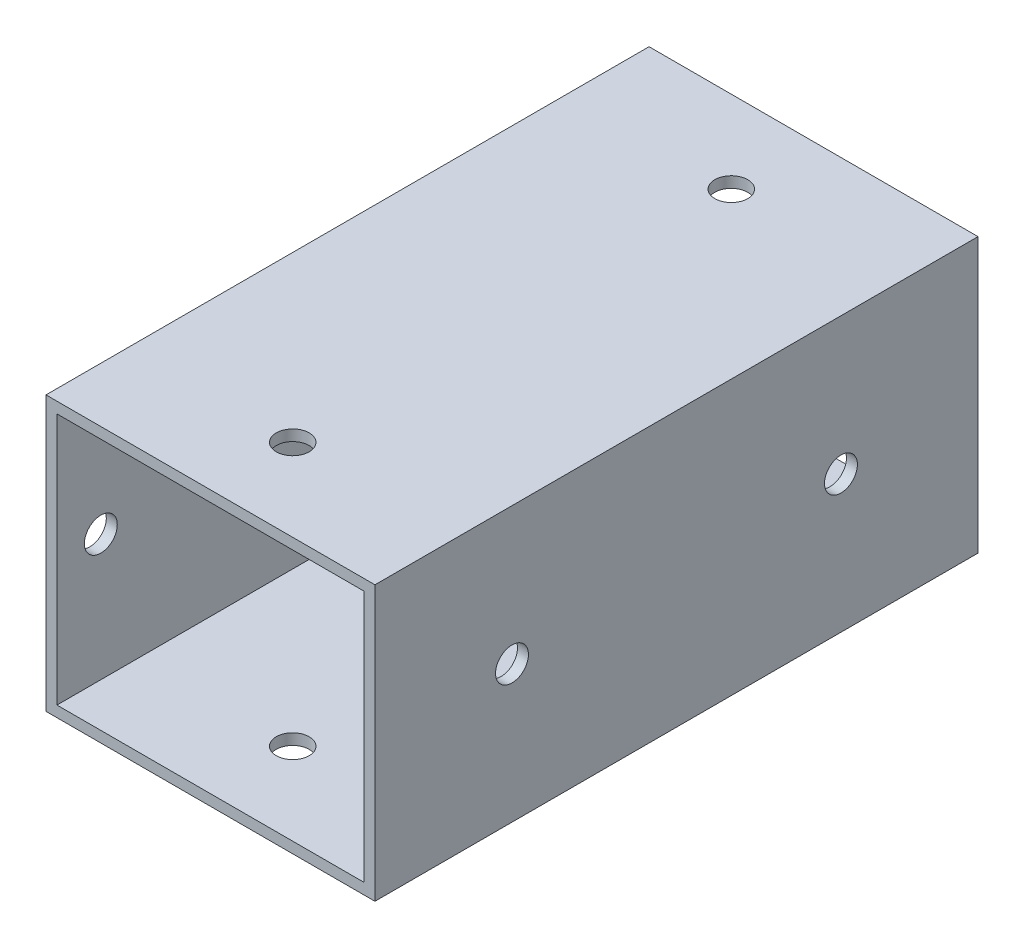
ISO-10303-21;
HEADER;
FILE_DESCRIPTION(('STEP AP214'),'2;1');
FILE_NAME('part.step','',(''),(''),'','','');
FILE_SCHEMA(('AUTOMOTIVE_DESIGN { 1 0 10303 214 1 1 1 1 }'));
ENDSEC;
DATA;
#1=APPLICATION_CONTEXT('core data for automotive mechanical design processes');
#2=APPLICATION_PROTOCOL_DEFINITION('international standard','automotive_design',2000,#1);
#3=PRODUCT_CONTEXT('',#1,'mechanical');
#4=PRODUCT('Part','Part','',(#3));
#5=PRODUCT_RELATED_PRODUCT_CATEGORY('part','',(#4));
#6=PRODUCT_DEFINITION_FORMATION('','',#4);
#7=PRODUCT_DEFINITION_CONTEXT('part definition',#1,'design');
#8=PRODUCT_DEFINITION('design','',#6,#7);
#9=PRODUCT_DEFINITION_SHAPE('','',#8);
#10=(LENGTH_UNIT() NAMED_UNIT(*) SI_UNIT(.MILLI.,.METRE.));
#11=(NAMED_UNIT(*) PLANE_ANGLE_UNIT() SI_UNIT($,.RADIAN.));
#12=(NAMED_UNIT(*) SI_UNIT($,.STERADIAN.) SOLID_ANGLE_UNIT());
#13=UNCERTAINTY_MEASURE_WITH_UNIT(LENGTH_MEASURE(1.E-05),#10,'distance_accuracy_value','');
#14=(GEOMETRIC_REPRESENTATION_CONTEXT(3) GLOBAL_UNCERTAINTY_ASSIGNED_CONTEXT((#13)) GLOBAL_UNIT_ASSIGNED_CONTEXT((#10,
#11,#12)) REPRESENTATION_CONTEXT('',''));
#15=CARTESIAN_POINT('',(0.,0.,0.));
#16=DIRECTION('',(0.,0.,1.));
#17=DIRECTION('',(1.,0.,0.));
#18=AXIS2_PLACEMENT_3D('',#15,#16,#17);
#19=CARTESIAN_POINT('',(0.,0.,27.5));
#20=DIRECTION('',(0.,0.,-1.));
#21=DIRECTION('',(-1.,0.,0.));
#22=AXIS2_PLACEMENT_3D('',#19,#20,#21);
#23=PLANE('',#22);
#24=DIRECTION('',(0.,1.,0.));
#25=VECTOR('',#24,1.);
#26=CARTESIAN_POINT('',(15.,-12.5,27.5));
#27=LINE('',#26,#25);
#28=CARTESIAN_POINT('',(15.,-12.5,27.5));
#29=VERTEX_POINT('',#28);
#30=CARTESIAN_POINT('',(15.,12.5,27.5));
#31=VERTEX_POINT('',#30);
#32=EDGE_CURVE('E139',#29,#31,#27,.T.);
#33=ORIENTED_EDGE('',*,*,#32,.T.);
#34=DIRECTION('',(-1.,0.,0.));
#35=VECTOR('',#34,1.);
#36=CARTESIAN_POINT('',(-15.,12.5,27.5));
#37=LINE('',#36,#35);
#38=CARTESIAN_POINT('',(-15.,12.5,27.5));
#39=VERTEX_POINT('',#38);
#40=EDGE_CURVE('E142',#31,#39,#37,.T.);
#41=ORIENTED_EDGE('',*,*,#40,.T.);
#42=DIRECTION('',(0.,-1.,0.));
#43=VECTOR('',#42,1.);
#44=CARTESIAN_POINT('',(-15.,-12.5,27.5));
#45=LINE('',#44,#43);
#46=CARTESIAN_POINT('',(-15.,-12.5,27.5));
#47=VERTEX_POINT('',#46);
#48=EDGE_CURVE('E145',#39,#47,#45,.T.);
#49=ORIENTED_EDGE('',*,*,#48,.T.);
#50=DIRECTION('',(1.,0.,0.));
#51=VECTOR('',#50,1.);
#52=CARTESIAN_POINT('',(-15.,-12.5,27.5));
#53=LINE('',#52,#51);
#54=EDGE_CURVE('E147',#47,#29,#53,.T.);
#55=ORIENTED_EDGE('',*,*,#54,.T.);
#56=EDGE_LOOP('',(#33,#41,#49,#55));
#57=FACE_BOUND('',#56,.T.);
#58=DIRECTION('',(1.,0.,0.));
#59=VECTOR('',#58,1.);
#60=CARTESIAN_POINT('',(-14.,-11.5,27.5));
#61=LINE('',#60,#59);
#62=CARTESIAN_POINT('',(-14.,-11.5,27.5));
#63=VERTEX_POINT('',#62);
#64=CARTESIAN_POINT('',(14.,-11.5,27.5));
#65=VERTEX_POINT('',#64);
#66=EDGE_CURVE('E101',#63,#65,#61,.T.);
#67=ORIENTED_EDGE('',*,*,#66,.F.);
#68=DIRECTION('',(0.,-1.,0.));
#69=VECTOR('',#68,1.);
#70=CARTESIAN_POINT('',(-14.,-11.5,27.5));
#71=LINE('',#70,#69);
#72=CARTESIAN_POINT('',(-14.,11.5,27.5));
#73=VERTEX_POINT('',#72);
#74=EDGE_CURVE('E123',#73,#63,#71,.T.);
#75=ORIENTED_EDGE('',*,*,#74,.F.);
#76=DIRECTION('',(-1.,0.,0.));
#77=VECTOR('',#76,1.);
#78=CARTESIAN_POINT('',(-14.,11.5,27.5));
#79=LINE('',#78,#77);
#80=CARTESIAN_POINT('',(14.,11.5,27.5));
#81=VERTEX_POINT('',#80);
#82=EDGE_CURVE('E121',#81,#73,#79,.T.);
#83=ORIENTED_EDGE('',*,*,#82,.F.);
#84=DIRECTION('',(0.,1.,0.));
#85=VECTOR('',#84,1.);
#86=CARTESIAN_POINT('',(14.,-11.5,27.5));
#87=LINE('',#86,#85);
#88=EDGE_CURVE('E109',#65,#81,#87,.T.);
#89=ORIENTED_EDGE('',*,*,#88,.F.);
#90=EDGE_LOOP('',(#67,#75,#83,#89));
#91=FACE_BOUND('',#90,.T.);
#92=ADVANCED_FACE('F34',(#57,#91),#23,.F.);
#93=CARTESIAN_POINT('',(0.,0.,-27.5));
#94=DIRECTION('',(0.,0.,-1.));
#95=DIRECTION('',(-1.,0.,0.));
#96=AXIS2_PLACEMENT_3D('',#93,#94,#95);
#97=PLANE('',#96);
#98=DIRECTION('',(0.,1.,0.));
#99=VECTOR('',#98,1.);
#100=CARTESIAN_POINT('',(15.,-12.5,-27.5));
#101=LINE('',#100,#99);
#102=CARTESIAN_POINT('',(15.,-12.5,-27.5));
#103=VERTEX_POINT('',#102);
#104=CARTESIAN_POINT('',(15.,12.5,-27.5));
#105=VERTEX_POINT('',#104);
#106=EDGE_CURVE('E117',#103,#105,#101,.T.);
#107=ORIENTED_EDGE('',*,*,#106,.F.);
#108=DIRECTION('',(1.,0.,0.));
#109=VECTOR('',#108,1.);
#110=CARTESIAN_POINT('',(-15.,-12.5,-27.5));
#111=LINE('',#110,#109);
#112=CARTESIAN_POINT('',(-15.,-12.5,-27.5));
#113=VERTEX_POINT('',#112);
#114=EDGE_CURVE('E143',#113,#103,#111,.T.);
#115=ORIENTED_EDGE('',*,*,#114,.F.);
#116=DIRECTION('',(0.,-1.,0.));
#117=VECTOR('',#116,1.);
#118=CARTESIAN_POINT('',(-15.,-12.5,-27.5));
#119=LINE('',#118,#117);
#120=CARTESIAN_POINT('',(-15.,12.5,-27.5));
#121=VERTEX_POINT('',#120);
#122=EDGE_CURVE('E154',#121,#113,#119,.T.);
#123=ORIENTED_EDGE('',*,*,#122,.F.);
#124=DIRECTION('',(-1.,0.,0.));
#125=VECTOR('',#124,1.);
#126=CARTESIAN_POINT('',(-15.,12.5,-27.5));
#127=LINE('',#126,#125);
#128=EDGE_CURVE('E152',#105,#121,#127,.T.);
#129=ORIENTED_EDGE('',*,*,#128,.F.);
#130=EDGE_LOOP('',(#107,#115,#123,#129));
#131=FACE_BOUND('',#130,.T.);
#132=DIRECTION('',(0.,-1.,0.));
#133=VECTOR('',#132,1.);
#134=CARTESIAN_POINT('',(-14.,-11.5,-27.5));
#135=LINE('',#134,#133);
#136=CARTESIAN_POINT('',(-14.,11.5,-27.5));
#137=VERTEX_POINT('',#136);
#138=CARTESIAN_POINT('',(-14.,-11.5,-27.5));
#139=VERTEX_POINT('',#138);
#140=EDGE_CURVE('E110',#137,#139,#135,.T.);
#141=ORIENTED_EDGE('',*,*,#140,.T.);
#142=DIRECTION('',(1.,0.,0.));
#143=VECTOR('',#142,1.);
#144=CARTESIAN_POINT('',(-14.,-11.5,-27.5));
#145=LINE('',#144,#143);
#146=CARTESIAN_POINT('',(14.,-11.5,-27.5));
#147=VERTEX_POINT('',#146);
#148=EDGE_CURVE('E59',#139,#147,#145,.T.);
#149=ORIENTED_EDGE('',*,*,#148,.T.);
#150=DIRECTION('',(0.,1.,0.));
#151=VECTOR('',#150,1.);
#152=CARTESIAN_POINT('',(14.,-11.5,-27.5));
#153=LINE('',#152,#151);
#154=CARTESIAN_POINT('',(14.,11.5,-27.5));
#155=VERTEX_POINT('',#154);
#156=EDGE_CURVE('E116',#147,#155,#153,.T.);
#157=ORIENTED_EDGE('',*,*,#156,.T.);
#158=DIRECTION('',(-1.,0.,0.));
#159=VECTOR('',#158,1.);
#160=CARTESIAN_POINT('',(-14.,11.5,-27.5));
#161=LINE('',#160,#159);
#162=EDGE_CURVE('E131',#155,#137,#161,.T.);
#163=ORIENTED_EDGE('',*,*,#162,.T.);
#164=EDGE_LOOP('',(#141,#149,#157,#163));
#165=FACE_BOUND('',#164,.T.);
#166=ADVANCED_FACE('F241',(#131,#165),#97,.T.);
#167=CARTESIAN_POINT('',(15.,-12.5,27.5));
#168=DIRECTION('',(-1.,0.,0.));
#169=DIRECTION('',(0.,0.,1.));
#170=AXIS2_PLACEMENT_3D('',#167,#168,#169);
#171=PLANE('',#170);
#172=CARTESIAN_POINT('',(15.,0.,-15.));
#173=DIRECTION('',(1.,0.,0.));
#174=DIRECTION('',(0.,0.,-1.));
#175=AXIS2_PLACEMENT_3D('',#172,#173,#174);
#176=CIRCLE('',#175,1.5);
#177=CARTESIAN_POINT('',(15.,0.,-16.5));
#178=VERTEX_POINT('',#177);
#179=EDGE_CURVE('E175',#178,#178,#176,.T.);
#180=ORIENTED_EDGE('',*,*,#179,.F.);
#181=EDGE_LOOP('',(#180));
#182=FACE_BOUND('',#181,.T.);
#183=CARTESIAN_POINT('',(15.,0.,15.));
#184=DIRECTION('',(1.,0.,0.));
#185=DIRECTION('',(0.,0.,-1.));
#186=AXIS2_PLACEMENT_3D('',#183,#184,#185);
#187=CIRCLE('',#186,1.5);
#188=CARTESIAN_POINT('',(15.,0.,13.5));
#189=VERTEX_POINT('',#188);
#190=EDGE_CURVE('E181',#189,#189,#187,.T.);
#191=ORIENTED_EDGE('',*,*,#190,.F.);
#192=EDGE_LOOP('',(#191));
#193=FACE_BOUND('',#192,.T.);
#194=ORIENTED_EDGE('',*,*,#106,.T.);
#195=DIRECTION('',(0.,0.,-1.));
#196=VECTOR('',#195,1.);
#197=CARTESIAN_POINT('',(15.,12.5,27.5));
#198=LINE('',#197,#196);
#199=EDGE_CURVE('E11',#31,#105,#198,.T.);
#200=ORIENTED_EDGE('',*,*,#199,.F.);
#201=ORIENTED_EDGE('',*,*,#32,.F.);
#202=DIRECTION('',(0.,0.,-1.));
#203=VECTOR('',#202,1.);
#204=CARTESIAN_POINT('',(15.,-12.5,27.5));
#205=LINE('',#204,#203);
#206=EDGE_CURVE('E149',#29,#103,#205,.T.);
#207=ORIENTED_EDGE('',*,*,#206,.T.);
#208=EDGE_LOOP('',(#194,#200,#201,#207));
#209=FACE_BOUND('',#208,.T.);
#210=ADVANCED_FACE('F36',(#182,#193,#209),#171,.F.);
#211=CARTESIAN_POINT('',(-15.,12.5,27.5));
#212=DIRECTION('',(0.,-1.,0.));
#213=DIRECTION('',(0.,0.,-1.));
#214=AXIS2_PLACEMENT_3D('',#211,#212,#213);
#215=PLANE('',#214);
#216=CARTESIAN_POINT('',(0.,12.5,-20.));
#217=DIRECTION('',(0.,1.,0.));
#218=DIRECTION('',(0.,0.,1.));
#219=AXIS2_PLACEMENT_3D('',#216,#217,#218);
#220=CIRCLE('',#219,1.5);
#221=CARTESIAN_POINT('',(0.,12.5,-18.5));
#222=VERTEX_POINT('',#221);
#223=EDGE_CURVE('E168',#222,#222,#220,.T.);
#224=ORIENTED_EDGE('',*,*,#223,.F.);
#225=EDGE_LOOP('',(#224));
#226=FACE_BOUND('',#225,.T.);
#227=CARTESIAN_POINT('',(0.,12.5,20.));
#228=DIRECTION('',(0.,1.,0.));
#229=DIRECTION('',(0.,0.,1.));
#230=AXIS2_PLACEMENT_3D('',#227,#228,#229);
#231=CIRCLE('',#230,1.5);
#232=CARTESIAN_POINT('',(0.,12.5,21.5));
#233=VERTEX_POINT('',#232);
#234=EDGE_CURVE('E205',#233,#233,#231,.T.);
#235=ORIENTED_EDGE('',*,*,#234,.F.);
#236=EDGE_LOOP('',(#235));
#237=FACE_BOUND('',#236,.T.);
#238=ORIENTED_EDGE('',*,*,#128,.T.);
#239=DIRECTION('',(0.,0.,-1.));
#240=VECTOR('',#239,1.);
#241=CARTESIAN_POINT('',(-15.,12.5,27.5));
#242=LINE('',#241,#240);
#243=EDGE_CURVE('E43',#39,#121,#242,.T.);
#244=ORIENTED_EDGE('',*,*,#243,.F.);
#245=ORIENTED_EDGE('',*,*,#40,.F.);
#246=ORIENTED_EDGE('',*,*,#199,.T.);
#247=EDGE_LOOP('',(#238,#244,#245,#246));
#248=FACE_BOUND('',#247,.T.);
#249=ADVANCED_FACE('F256',(#226,#237,#248),#215,.F.);
#250=CARTESIAN_POINT('',(-15.,-12.5,27.5));
#251=DIRECTION('',(1.,0.,0.));
#252=DIRECTION('',(0.,0.,-1.));
#253=AXIS2_PLACEMENT_3D('',#250,#251,#252);
#254=PLANE('',#253);
#255=CARTESIAN_POINT('',(-15.,0.,-23.5));
#256=DIRECTION('',(1.,0.,0.));
#257=DIRECTION('',(0.,0.,-1.));
#258=AXIS2_PLACEMENT_3D('',#255,#256,#257);
#259=CIRCLE('',#258,1.5);
#260=CARTESIAN_POINT('',(-15.,0.,-25.));
#261=VERTEX_POINT('',#260);
#262=EDGE_CURVE('E202',#261,#261,#259,.T.);
#263=ORIENTED_EDGE('',*,*,#262,.T.);
#264=EDGE_LOOP('',(#263));
#265=FACE_BOUND('',#264,.T.);
#266=CARTESIAN_POINT('',(-15.,0.,23.5));
#267=DIRECTION('',(1.,0.,0.));
#268=DIRECTION('',(0.,0.,-1.));
#269=AXIS2_PLACEMENT_3D('',#266,#267,#268);
#270=CIRCLE('',#269,1.5);
#271=CARTESIAN_POINT('',(-15.,0.,22.));
#272=VERTEX_POINT('',#271);
#273=EDGE_CURVE('E199',#272,#272,#270,.T.);
#274=ORIENTED_EDGE('',*,*,#273,.T.);
#275=EDGE_LOOP('',(#274));
#276=FACE_BOUND('',#275,.T.);
#277=CARTESIAN_POINT('',(-15.,0.,0.));
#278=DIRECTION('',(1.,0.,0.));
#279=DIRECTION('',(0.,0.,-1.));
#280=AXIS2_PLACEMENT_3D('',#277,#278,#279);
#281=CIRCLE('',#280,1.5);
#282=CARTESIAN_POINT('',(-15.,0.,-1.5));
#283=VERTEX_POINT('',#282);
#284=EDGE_CURVE('E196',#283,#283,#281,.T.);
#285=ORIENTED_EDGE('',*,*,#284,.T.);
#286=EDGE_LOOP('',(#285));
#287=FACE_BOUND('',#286,.T.);
#288=ORIENTED_EDGE('',*,*,#122,.T.);
#289=DIRECTION('',(0.,0.,-1.));
#290=VECTOR('',#289,1.);
#291=CARTESIAN_POINT('',(-15.,-12.5,27.5));
#292=LINE('',#291,#290);
#293=EDGE_CURVE('E159',#47,#113,#292,.T.);
#294=ORIENTED_EDGE('',*,*,#293,.F.);
#295=ORIENTED_EDGE('',*,*,#48,.F.);
#296=ORIENTED_EDGE('',*,*,#243,.T.);
#297=EDGE_LOOP('',(#288,#294,#295,#296));
#298=FACE_BOUND('',#297,.T.);
#299=ADVANCED_FACE('F254',(#265,#276,#287,#298),#254,.F.);
#300=CARTESIAN_POINT('',(-15.,-12.5,27.5));
#301=DIRECTION('',(0.,1.,0.));
#302=DIRECTION('',(0.,0.,1.));
#303=AXIS2_PLACEMENT_3D('',#300,#301,#302);
#304=PLANE('',#303);
#305=CARTESIAN_POINT('',(0.,-12.5,-20.));
#306=DIRECTION('',(0.,1.,0.));
#307=DIRECTION('',(0.,0.,1.));
#308=AXIS2_PLACEMENT_3D('',#305,#306,#307);
#309=CIRCLE('',#308,1.5);
#310=CARTESIAN_POINT('',(0.,-12.5,-18.5));
#311=VERTEX_POINT('',#310);
#312=EDGE_CURVE('E129',#311,#311,#309,.T.);
#313=ORIENTED_EDGE('',*,*,#312,.T.);
#314=EDGE_LOOP('',(#313));
#315=FACE_BOUND('',#314,.T.);
#316=CARTESIAN_POINT('',(0.,-12.5,20.));
#317=DIRECTION('',(0.,1.,0.));
#318=DIRECTION('',(0.,0.,1.));
#319=AXIS2_PLACEMENT_3D('',#316,#317,#318);
#320=CIRCLE('',#319,1.5);
#321=CARTESIAN_POINT('',(0.,-12.5,21.5));
#322=VERTEX_POINT('',#321);
#323=EDGE_CURVE('E172',#322,#322,#320,.T.);
#324=ORIENTED_EDGE('',*,*,#323,.T.);
#325=EDGE_LOOP('',(#324));
#326=FACE_BOUND('',#325,.T.);
#327=ORIENTED_EDGE('',*,*,#114,.T.);
#328=ORIENTED_EDGE('',*,*,#206,.F.);
#329=ORIENTED_EDGE('',*,*,#54,.F.);
#330=ORIENTED_EDGE('',*,*,#293,.T.);
#331=EDGE_LOOP('',(#327,#328,#329,#330));
#332=FACE_BOUND('',#331,.T.);
#333=ADVANCED_FACE('F218',(#315,#326,#332),#304,.F.);
#334=CARTESIAN_POINT('',(-14.,-11.5,27.5));
#335=DIRECTION('',(0.,1.,0.));
#336=DIRECTION('',(0.,0.,1.));
#337=AXIS2_PLACEMENT_3D('',#334,#335,#336);
#338=PLANE('',#337);
#339=CARTESIAN_POINT('',(0.,-11.5,-20.));
#340=DIRECTION('',(0.,1.,0.));
#341=DIRECTION('',(0.,0.,1.));
#342=AXIS2_PLACEMENT_3D('',#339,#340,#341);
#343=CIRCLE('',#342,1.5);
#344=CARTESIAN_POINT('',(0.,-11.5,-18.5));
#345=VERTEX_POINT('',#344);
#346=EDGE_CURVE('E171',#345,#345,#343,.T.);
#347=ORIENTED_EDGE('',*,*,#346,.F.);
#348=EDGE_LOOP('',(#347));
#349=FACE_BOUND('',#348,.T.);
#350=CARTESIAN_POINT('',(0.,-11.5,20.));
#351=DIRECTION('',(0.,1.,0.));
#352=DIRECTION('',(0.,0.,1.));
#353=AXIS2_PLACEMENT_3D('',#350,#351,#352);
#354=CIRCLE('',#353,1.5);
#355=CARTESIAN_POINT('',(0.,-11.5,21.5));
#356=VERTEX_POINT('',#355);
#357=EDGE_CURVE('E167',#356,#356,#354,.T.);
#358=ORIENTED_EDGE('',*,*,#357,.F.);
#359=EDGE_LOOP('',(#358));
#360=FACE_BOUND('',#359,.T.);
#361=ORIENTED_EDGE('',*,*,#148,.F.);
#362=DIRECTION('',(0.,0.,-1.));
#363=VECTOR('',#362,1.);
#364=CARTESIAN_POINT('',(-14.,-11.5,27.5));
#365=LINE('',#364,#363);
#366=EDGE_CURVE('E105',#63,#139,#365,.T.);
#367=ORIENTED_EDGE('',*,*,#366,.F.);
#368=ORIENTED_EDGE('',*,*,#66,.T.);
#369=DIRECTION('',(0.,0.,-1.));
#370=VECTOR('',#369,1.);
#371=CARTESIAN_POINT('',(14.,-11.5,27.5));
#372=LINE('',#371,#370);
#373=EDGE_CURVE('E104',#65,#147,#372,.T.);
#374=ORIENTED_EDGE('',*,*,#373,.T.);
#375=EDGE_LOOP('',(#361,#367,#368,#374));
#376=FACE_BOUND('',#375,.T.);
#377=ADVANCED_FACE('F103',(#349,#360,#376),#338,.T.);
#378=CARTESIAN_POINT('',(14.,-11.5,27.5));
#379=DIRECTION('',(-1.,0.,0.));
#380=DIRECTION('',(0.,-1.,0.));
#381=AXIS2_PLACEMENT_3D('',#378,#379,#380);
#382=PLANE('',#381);
#383=CARTESIAN_POINT('',(14.,0.,-15.));
#384=DIRECTION('',(-1.,0.,0.));
#385=DIRECTION('',(0.,-1.,0.));
#386=AXIS2_PLACEMENT_3D('',#383,#384,#385);
#387=CIRCLE('',#386,1.5);
#388=CARTESIAN_POINT('',(14.,-1.5,-15.));
#389=VERTEX_POINT('',#388);
#390=EDGE_CURVE('E38',#389,#389,#387,.T.);
#391=ORIENTED_EDGE('',*,*,#390,.F.);
#392=EDGE_LOOP('',(#391));
#393=FACE_BOUND('',#392,.T.);
#394=CARTESIAN_POINT('',(14.,0.,15.));
#395=DIRECTION('',(-1.,0.,0.));
#396=DIRECTION('',(0.,-1.,0.));
#397=AXIS2_PLACEMENT_3D('',#394,#395,#396);
#398=CIRCLE('',#397,1.5);
#399=CARTESIAN_POINT('',(14.,-1.5,15.));
#400=VERTEX_POINT('',#399);
#401=EDGE_CURVE('E173',#400,#400,#398,.T.);
#402=ORIENTED_EDGE('',*,*,#401,.F.);
#403=EDGE_LOOP('',(#402));
#404=FACE_BOUND('',#403,.T.);
#405=ORIENTED_EDGE('',*,*,#156,.F.);
#406=ORIENTED_EDGE('',*,*,#373,.F.);
#407=ORIENTED_EDGE('',*,*,#88,.T.);
#408=DIRECTION('',(0.,0.,-1.));
#409=VECTOR('',#408,1.);
#410=CARTESIAN_POINT('',(14.,11.5,27.5));
#411=LINE('',#410,#409);
#412=EDGE_CURVE('E118',#81,#155,#411,.T.);
#413=ORIENTED_EDGE('',*,*,#412,.T.);
#414=EDGE_LOOP('',(#405,#406,#407,#413));
#415=FACE_BOUND('',#414,.T.);
#416=ADVANCED_FACE('F113',(#393,#404,#415),#382,.T.);
#417=CARTESIAN_POINT('',(-14.,11.5,27.5));
#418=DIRECTION('',(0.,-1.,0.));
#419=DIRECTION('',(0.,0.,-1.));
#420=AXIS2_PLACEMENT_3D('',#417,#418,#419);
#421=PLANE('',#420);
#422=CARTESIAN_POINT('',(0.,11.5,-20.));
#423=DIRECTION('',(0.,-1.,0.));
#424=DIRECTION('',(0.,0.,-1.));
#425=AXIS2_PLACEMENT_3D('',#422,#423,#424);
#426=CIRCLE('',#425,1.5);
#427=CARTESIAN_POINT('',(0.,11.5,-21.5));
#428=VERTEX_POINT('',#427);
#429=EDGE_CURVE('E169',#428,#428,#426,.T.);
#430=ORIENTED_EDGE('',*,*,#429,.F.);
#431=EDGE_LOOP('',(#430));
#432=FACE_BOUND('',#431,.T.);
#433=CARTESIAN_POINT('',(0.,11.5,20.));
#434=DIRECTION('',(0.,-1.,0.));
#435=DIRECTION('',(0.,0.,-1.));
#436=AXIS2_PLACEMENT_3D('',#433,#434,#435);
#437=CIRCLE('',#436,1.5);
#438=CARTESIAN_POINT('',(0.,11.5,18.5));
#439=VERTEX_POINT('',#438);
#440=EDGE_CURVE('E164',#439,#439,#437,.T.);
#441=ORIENTED_EDGE('',*,*,#440,.F.);
#442=EDGE_LOOP('',(#441));
#443=FACE_BOUND('',#442,.T.);
#444=ORIENTED_EDGE('',*,*,#162,.F.);
#445=ORIENTED_EDGE('',*,*,#412,.F.);
#446=ORIENTED_EDGE('',*,*,#82,.T.);
#447=DIRECTION('',(0.,0.,-1.));
#448=VECTOR('',#447,1.);
#449=CARTESIAN_POINT('',(-14.,11.5,27.5));
#450=LINE('',#449,#448);
#451=EDGE_CURVE('E51',#73,#137,#450,.T.);
#452=ORIENTED_EDGE('',*,*,#451,.T.);
#453=EDGE_LOOP('',(#444,#445,#446,#452));
#454=FACE_BOUND('',#453,.T.);
#455=ADVANCED_FACE('F285',(#432,#443,#454),#421,.T.);
#456=CARTESIAN_POINT('',(-14.,-11.5,27.5));
#457=DIRECTION('',(1.,0.,0.));
#458=DIRECTION('',(0.,0.,-1.));
#459=AXIS2_PLACEMENT_3D('',#456,#457,#458);
#460=PLANE('',#459);
#461=CARTESIAN_POINT('',(-14.,0.,-23.5));
#462=DIRECTION('',(1.,0.,0.));
#463=DIRECTION('',(0.,0.,1.));
#464=AXIS2_PLACEMENT_3D('',#461,#462,#463);
#465=CIRCLE('',#464,1.5);
#466=CARTESIAN_POINT('',(-14.,0.,-22.));
#467=VERTEX_POINT('',#466);
#468=EDGE_CURVE('E179',#467,#467,#465,.T.);
#469=ORIENTED_EDGE('',*,*,#468,.F.);
#470=EDGE_LOOP('',(#469));
#471=FACE_BOUND('',#470,.T.);
#472=CARTESIAN_POINT('',(-14.,0.,23.5));
#473=DIRECTION('',(1.,0.,0.));
#474=DIRECTION('',(0.,0.,-1.));
#475=AXIS2_PLACEMENT_3D('',#472,#473,#474);
#476=CIRCLE('',#475,1.5);
#477=CARTESIAN_POINT('',(-14.,0.,22.));
#478=VERTEX_POINT('',#477);
#479=EDGE_CURVE('E188',#478,#478,#476,.T.);
#480=ORIENTED_EDGE('',*,*,#479,.F.);
#481=EDGE_LOOP('',(#480));
#482=FACE_BOUND('',#481,.T.);
#483=CARTESIAN_POINT('',(-14.,0.,0.));
#484=DIRECTION('',(1.,0.,0.));
#485=DIRECTION('',(0.,0.,-1.));
#486=AXIS2_PLACEMENT_3D('',#483,#484,#485);
#487=CIRCLE('',#486,1.5);
#488=CARTESIAN_POINT('',(-14.,0.,-1.5));
#489=VERTEX_POINT('',#488);
#490=EDGE_CURVE('E191',#489,#489,#487,.T.);
#491=ORIENTED_EDGE('',*,*,#490,.F.);
#492=EDGE_LOOP('',(#491));
#493=FACE_BOUND('',#492,.T.);
#494=ORIENTED_EDGE('',*,*,#140,.F.);
#495=ORIENTED_EDGE('',*,*,#451,.F.);
#496=ORIENTED_EDGE('',*,*,#74,.T.);
#497=ORIENTED_EDGE('',*,*,#366,.T.);
#498=EDGE_LOOP('',(#494,#495,#496,#497));
#499=FACE_BOUND('',#498,.T.);
#500=ADVANCED_FACE('F283',(#471,#482,#493,#499),#460,.T.);
#501=CARTESIAN_POINT('',(0.,-57.5,20.));
#502=DIRECTION('',(0.,1.,0.));
#503=DIRECTION('',(0.,0.,1.));
#504=AXIS2_PLACEMENT_3D('',#501,#502,#503);
#505=CYLINDRICAL_SURFACE('',#504,1.5);
#506=ORIENTED_EDGE('',*,*,#440,.T.);
#507=EDGE_LOOP('',(#506));
#508=FACE_BOUND('',#507,.T.);
#509=ORIENTED_EDGE('',*,*,#234,.T.);
#510=EDGE_LOOP('',(#509));
#511=FACE_BOUND('',#510,.T.);
#512=ADVANCED_FACE('F237',(#508,#511),#505,.F.);
#513=CARTESIAN_POINT('',(0.,-57.5,-20.));
#514=DIRECTION('',(0.,1.,0.));
#515=DIRECTION('',(0.,0.,1.));
#516=AXIS2_PLACEMENT_3D('',#513,#514,#515);
#517=CYLINDRICAL_SURFACE('',#516,1.5);
#518=ORIENTED_EDGE('',*,*,#429,.T.);
#519=EDGE_LOOP('',(#518));
#520=FACE_BOUND('',#519,.T.);
#521=ORIENTED_EDGE('',*,*,#223,.T.);
#522=EDGE_LOOP('',(#521));
#523=FACE_BOUND('',#522,.T.);
#524=ADVANCED_FACE('F227',(#520,#523),#517,.F.);
#525=ORIENTED_EDGE('',*,*,#357,.T.);
#526=EDGE_LOOP('',(#525));
#527=FACE_BOUND('',#526,.T.);
#528=ORIENTED_EDGE('',*,*,#323,.F.);
#529=EDGE_LOOP('',(#528));
#530=FACE_BOUND('',#529,.T.);
#531=ADVANCED_FACE('F224',(#527,#530),#505,.F.);
#532=ORIENTED_EDGE('',*,*,#346,.T.);
#533=EDGE_LOOP('',(#532));
#534=FACE_BOUND('',#533,.T.);
#535=ORIENTED_EDGE('',*,*,#312,.F.);
#536=EDGE_LOOP('',(#535));
#537=FACE_BOUND('',#536,.T.);
#538=ADVANCED_FACE('F221',(#534,#537),#517,.F.);
#539=CARTESIAN_POINT('',(-34.,0.,0.));
#540=DIRECTION('',(1.,0.,0.));
#541=DIRECTION('',(0.,0.,-1.));
#542=AXIS2_PLACEMENT_3D('',#539,#540,#541);
#543=CYLINDRICAL_SURFACE('',#542,1.5);
#544=ORIENTED_EDGE('',*,*,#490,.T.);
#545=EDGE_LOOP('',(#544));
#546=FACE_BOUND('',#545,.T.);
#547=ORIENTED_EDGE('',*,*,#284,.F.);
#548=EDGE_LOOP('',(#547));
#549=FACE_BOUND('',#548,.T.);
#550=ADVANCED_FACE('F223',(#546,#549),#543,.F.);
#551=CARTESIAN_POINT('',(-34.,0.,23.5));
#552=DIRECTION('',(1.,0.,0.));
#553=DIRECTION('',(0.,0.,-1.));
#554=AXIS2_PLACEMENT_3D('',#551,#552,#553);
#555=CYLINDRICAL_SURFACE('',#554,1.5);
#556=ORIENTED_EDGE('',*,*,#479,.T.);
#557=EDGE_LOOP('',(#556));
#558=FACE_BOUND('',#557,.T.);
#559=ORIENTED_EDGE('',*,*,#273,.F.);
#560=EDGE_LOOP('',(#559));
#561=FACE_BOUND('',#560,.T.);
#562=ADVANCED_FACE('F232',(#558,#561),#555,.F.);
#563=CARTESIAN_POINT('',(-34.,0.,-23.5));
#564=DIRECTION('',(1.,0.,0.));
#565=DIRECTION('',(0.,0.,-1.));
#566=AXIS2_PLACEMENT_3D('',#563,#564,#565);
#567=CYLINDRICAL_SURFACE('',#566,1.5);
#568=ORIENTED_EDGE('',*,*,#468,.T.);
#569=EDGE_LOOP('',(#568));
#570=FACE_BOUND('',#569,.T.);
#571=ORIENTED_EDGE('',*,*,#262,.F.);
#572=EDGE_LOOP('',(#571));
#573=FACE_BOUND('',#572,.T.);
#574=ADVANCED_FACE('F313',(#570,#573),#567,.F.);
#575=CARTESIAN_POINT('',(-5.,0.,15.));
#576=DIRECTION('',(1.,0.,0.));
#577=DIRECTION('',(0.,0.,-1.));
#578=AXIS2_PLACEMENT_3D('',#575,#576,#577);
#579=CYLINDRICAL_SURFACE('',#578,1.5);
#580=ORIENTED_EDGE('',*,*,#401,.T.);
#581=EDGE_LOOP('',(#580));
#582=FACE_BOUND('',#581,.T.);
#583=ORIENTED_EDGE('',*,*,#190,.T.);
#584=EDGE_LOOP('',(#583));
#585=FACE_BOUND('',#584,.T.);
#586=ADVANCED_FACE('F308',(#582,#585),#579,.F.);
#587=CARTESIAN_POINT('',(-5.,0.,-15.));
#588=DIRECTION('',(1.,0.,0.));
#589=DIRECTION('',(0.,0.,-1.));
#590=AXIS2_PLACEMENT_3D('',#587,#588,#589);
#591=CYLINDRICAL_SURFACE('',#590,1.5);
#592=ORIENTED_EDGE('',*,*,#390,.T.);
#593=EDGE_LOOP('',(#592));
#594=FACE_BOUND('',#593,.T.);
#595=ORIENTED_EDGE('',*,*,#179,.T.);
#596=EDGE_LOOP('',(#595));
#597=FACE_BOUND('',#596,.T.);
#598=ADVANCED_FACE('F306',(#594,#597),#591,.F.);
#599=CLOSED_SHELL('',(#92,#166,#210,#249,#299,#333,#377,#416,#455,#500,#512,#524,#531,#538,#550,
#562,#574,#586,#598));
#600=MANIFOLD_SOLID_BREP('B2',#599);
#601=ADVANCED_BREP_SHAPE_REPRESENTATION('',(#18,#600),#14);
#602=SHAPE_DEFINITION_REPRESENTATION(#9,#601);
ENDSEC;
END-ISO-10303-21;
